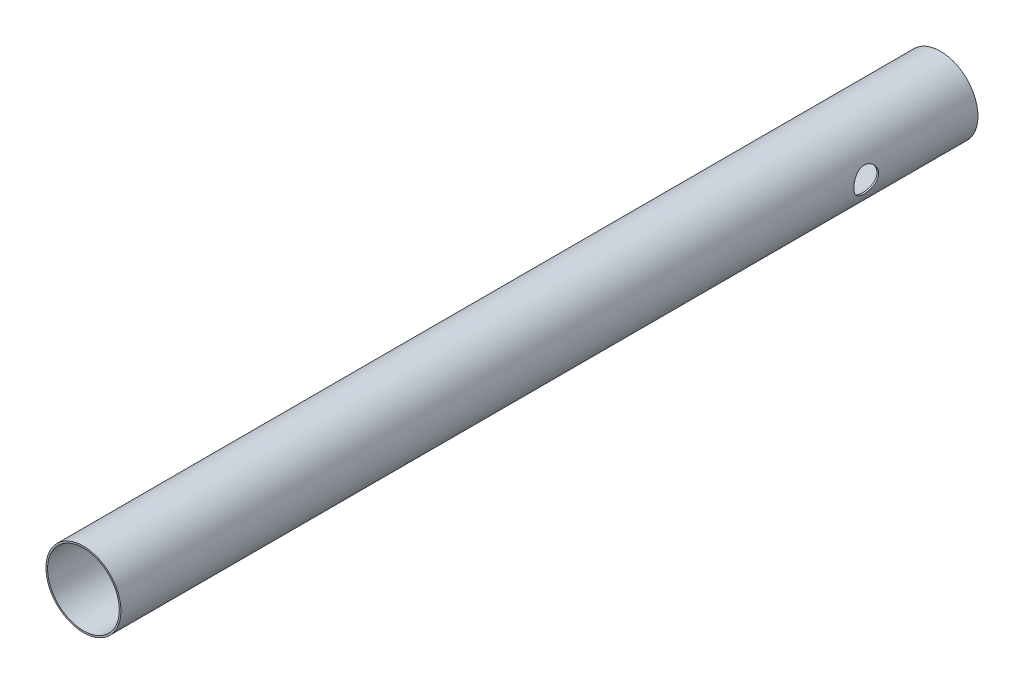
ISO-10303-21;
HEADER;
FILE_DESCRIPTION(('STEP AP214'),'2;1');
FILE_NAME('part.step','',(''),(''),'','','');
FILE_SCHEMA(('AUTOMOTIVE_DESIGN { 1 0 10303 214 1 1 1 1 }'));
ENDSEC;
DATA;
#1=APPLICATION_CONTEXT('core data for automotive mechanical design processes');
#2=APPLICATION_PROTOCOL_DEFINITION('international standard','automotive_design',2000,#1);
#3=PRODUCT_CONTEXT('',#1,'mechanical');
#4=PRODUCT('Part','Part','',(#3));
#5=PRODUCT_RELATED_PRODUCT_CATEGORY('part','',(#4));
#6=PRODUCT_DEFINITION_FORMATION('','',#4);
#7=PRODUCT_DEFINITION_CONTEXT('part definition',#1,'design');
#8=PRODUCT_DEFINITION('design','',#6,#7);
#9=PRODUCT_DEFINITION_SHAPE('','',#8);
#10=(LENGTH_UNIT() NAMED_UNIT(*) SI_UNIT(.MILLI.,.METRE.));
#11=(NAMED_UNIT(*) PLANE_ANGLE_UNIT() SI_UNIT($,.RADIAN.));
#12=(NAMED_UNIT(*) SI_UNIT($,.STERADIAN.) SOLID_ANGLE_UNIT());
#13=UNCERTAINTY_MEASURE_WITH_UNIT(LENGTH_MEASURE(1.E-05),#10,'distance_accuracy_value','');
#14=(GEOMETRIC_REPRESENTATION_CONTEXT(3) GLOBAL_UNCERTAINTY_ASSIGNED_CONTEXT((#13)) GLOBAL_UNIT_ASSIGNED_CONTEXT((#10,
#11,#12)) REPRESENTATION_CONTEXT('',''));
#15=CARTESIAN_POINT('',(0.,0.,0.));
#16=DIRECTION('',(0.,0.,1.));
#17=DIRECTION('',(1.,0.,0.));
#18=AXIS2_PLACEMENT_3D('',#15,#16,#17);
#19=CARTESIAN_POINT('',(0.,0.,-114.3));
#20=DIRECTION('',(0.,0.,1.));
#21=DIRECTION('',(1.,0.,0.));
#22=AXIS2_PLACEMENT_3D('',#19,#20,#21);
#23=CYLINDRICAL_SURFACE('',#22,38.354);
#24=CARTESIAN_POINT('',(0.,0.,-114.3));
#25=DIRECTION('',(0.,0.,1.));
#26=DIRECTION('',(1.,0.,0.));
#27=AXIS2_PLACEMENT_3D('',#24,#25,#26);
#28=CIRCLE('',#27,38.354);
#29=CARTESIAN_POINT('',(38.354,0.,-114.3));
#30=VERTEX_POINT('',#29);
#31=EDGE_CURVE('E10',#30,#30,#28,.T.);
#32=ORIENTED_EDGE('',*,*,#31,.T.);
#33=EDGE_LOOP('',(#32));
#34=FACE_BOUND('',#33,.T.);
#35=CARTESIAN_POINT('',(0.,0.,762.));
#36=DIRECTION('',(0.,0.,1.));
#37=DIRECTION('',(1.,0.,0.));
#38=AXIS2_PLACEMENT_3D('',#35,#36,#37);
#39=CIRCLE('',#38,38.354);
#40=CARTESIAN_POINT('',(38.354,0.,762.));
#41=VERTEX_POINT('',#40);
#42=EDGE_CURVE('E64',#41,#41,#39,.T.);
#43=ORIENTED_EDGE('',*,*,#42,.F.);
#44=EDGE_LOOP('',(#43));
#45=FACE_BOUND('',#44,.T.);
#46=CARTESIAN_POINT('',(38.354,0.,12.7));
#47=CARTESIAN_POINT('',(38.3540000493044,0.346608619146713,12.7000000775963));
#48=CARTESIAN_POINT('',(38.3492907128234,0.693216154606999,12.6857991326662));
#49=CARTESIAN_POINT('',(38.3305830123983,1.38385618020903,12.6291326372584));
#50=CARTESIAN_POINT('',(38.3165846889567,1.72788868157198,12.5866672100213));
#51=CARTESIAN_POINT('',(38.2796798010668,2.41089498344884,12.4738688931755));
#52=CARTESIAN_POINT('',(38.2567724372097,2.74986832716919,12.4035335027826));
#53=CARTESIAN_POINT('',(38.2026679211,3.42032162893621,12.2356376664278));
#54=CARTESIAN_POINT('',(38.1714707206801,3.75180154343092,12.1380770622764));
#55=CARTESIAN_POINT('',(38.1016751459268,4.40445273633742,11.9167668667314));
#56=CARTESIAN_POINT('',(38.0630894444205,4.72564058227501,11.7930620809388));
#57=CARTESIAN_POINT('',(37.9794867125445,5.35621814577783,11.5203701972046));
#58=CARTESIAN_POINT('',(37.9344696989119,5.66560789404444,11.3713831650587));
#59=CARTESIAN_POINT('',(37.8391560266141,6.27067747666276,11.0492566909436));
#60=CARTESIAN_POINT('',(37.7888594993686,6.56635765201449,10.8761178501353));
#61=CARTESIAN_POINT('',(37.684234604624,7.14237425122249,10.50683493065));
#62=CARTESIAN_POINT('',(37.629904793183,7.42270511690967,10.3106825982647));
#63=CARTESIAN_POINT('',(37.516876005993,7.97465414849725,9.8903430535432));
#64=CARTESIAN_POINT('',(37.4580941185265,8.24574103459471,9.66548029444939));
#65=CARTESIAN_POINT('',(37.3392598973929,8.76816787035007,9.19418311120439));
#66=CARTESIAN_POINT('',(37.2792075359525,9.01950738775308,8.947748215105));
#67=CARTESIAN_POINT('',(37.159410967394,9.50100392623369,8.43473321550048));
#68=CARTESIAN_POINT('',(37.0996668861884,9.73115285306928,8.16814548437142));
#69=CARTESIAN_POINT('',(36.982150882995,10.1686345833711,7.61660855228789));
#70=CARTESIAN_POINT('',(36.9243782913845,10.3759751880481,7.33166568261063));
#71=CARTESIAN_POINT('',(36.8107888158904,10.7721318253782,6.73665583938064));
#72=CARTESIAN_POINT('',(36.7550748964656,10.9602497556524,6.4261037655917));
#73=CARTESIAN_POINT('',(36.6491024955132,11.3095505445197,5.78929612922831));
#74=CARTESIAN_POINT('',(36.5988441434059,11.4707327641771,5.46304019438262));
#75=CARTESIAN_POINT('',(36.5053831962393,11.7647833494334,4.79711530856339));
#76=CARTESIAN_POINT('',(36.4621789465311,11.8976583571626,4.45744952635741));
#77=CARTESIAN_POINT('',(36.3842349156935,12.1339302590436,3.76707165015623));
#78=CARTESIAN_POINT('',(36.3494947592375,12.2373284603318,3.4163600467494));
#79=CARTESIAN_POINT('',(36.2906599816199,12.4106976781298,2.71837349134683));
#80=CARTESIAN_POINT('',(36.2662493073493,12.4816674168499,2.37137319027426));
#81=CARTESIAN_POINT('',(36.2272473003618,12.5944210658967,1.67211372153357));
#82=CARTESIAN_POINT('',(36.212655766156,12.6362055751055,1.3198546619269));
#83=CARTESIAN_POINT('',(36.1937857654808,12.6901539880783,0.612892420342079));
#84=CARTESIAN_POINT('',(36.1895045860218,12.7023256839452,0.258189905957597));
#85=CARTESIAN_POINT('',(36.1913936047527,12.6969428313659,-0.450956312808769));
#86=CARTESIAN_POINT('',(36.1975635131064,12.679389107284,-0.805400024095227));
#87=CARTESIAN_POINT('',(36.2196328238879,12.6162022726288,-1.49531954387969));
#88=CARTESIAN_POINT('',(36.2350810038449,12.5718708795356,-1.83093002369664));
#89=CARTESIAN_POINT('',(36.2748385070344,12.4566895371294,-2.49702139350318));
#90=CARTESIAN_POINT('',(36.2991475244303,12.3858405030842,-2.82750246012671));
#91=CARTESIAN_POINT('',(36.3559017440017,12.2182461452673,-3.48113607780465));
#92=CARTESIAN_POINT('',(36.3883476100467,12.1214987084518,-3.80428802854377));
#93=CARTESIAN_POINT('',(36.4604324256871,11.9029161919708,-4.4411645783651));
#94=CARTESIAN_POINT('',(36.5000715640481,11.7810804539273,-4.75488892979656));
#95=CARTESIAN_POINT('',(36.5861027259181,11.5111585146129,-5.37583818164387));
#96=CARTESIAN_POINT('',(36.6325911470783,11.362689609778,-5.68288327111756));
#97=CARTESIAN_POINT('',(36.7305642323169,11.0418790488918,-6.28354072437708));
#98=CARTESIAN_POINT('',(36.7820507355843,10.8695285948864,-6.57714808443472));
#99=CARTESIAN_POINT('',(36.8886130638769,10.5021947657251,-7.14908375831122));
#100=CARTESIAN_POINT('',(36.9436883096209,10.3072150393512,-7.42741452472328));
#101=CARTESIAN_POINT('',(37.0560280412202,9.89573632914247,-7.96741434842017));
#102=CARTESIAN_POINT('',(37.1132935273178,9.67922743935104,-8.22907564408642));
#103=CARTESIAN_POINT('',(37.2315102727711,9.21435758989426,-8.74716509346786));
#104=CARTESIAN_POINT('',(37.2924993989009,8.96493019051237,-9.00262875823346));
#105=CARTESIAN_POINT('',(37.4135625447484,8.44545673499238,-9.49165217190122));
#106=CARTESIAN_POINT('',(37.4736369359882,8.17541933293374,-9.72522102356878));
#107=CARTESIAN_POINT('',(37.5912926375788,7.61614842114486,-10.1691597885803));
#108=CARTESIAN_POINT('',(37.6488726162076,7.32690486130588,-10.3795174003582));
#109=CARTESIAN_POINT('',(37.7599129827998,6.73127135439834,-10.7753326702776));
#110=CARTESIAN_POINT('',(37.8133750220724,6.42488836628661,-10.9608003317637));
#111=CARTESIAN_POINT('',(37.9152406672159,5.79370563459675,-11.3072479245701));
#112=CARTESIAN_POINT('',(37.9635887262647,5.46875313293128,-11.4679661977654));
#113=CARTESIAN_POINT('',(38.053236636367,4.80546342051625,-11.7613358626229));
#114=CARTESIAN_POINT('',(38.094536398965,4.46712604185322,-11.8939869020486));
#115=CARTESIAN_POINT('',(38.168880829881,3.77959795977295,-12.1299916041445));
#116=CARTESIAN_POINT('',(38.2019277914561,3.43041030178402,-12.2333534066751));
#117=CARTESIAN_POINT('',(38.2588052232789,2.72374039936429,-12.4098287975175));
#118=CARTESIAN_POINT('',(38.282636111525,2.3662585319003,-12.4829437576971));
#119=CARTESIAN_POINT('',(38.3195605698831,1.66126737185945,-12.5957180611134));
#120=CARTESIAN_POINT('',(38.3330705475255,1.31398730104149,-12.636676948026));
#121=CARTESIAN_POINT('',(38.3506210975933,0.616996820413901,-12.6898170912854));
#122=CARTESIAN_POINT('',(38.3546619408564,0.26728648040219,-12.7019991707112));
#123=CARTESIAN_POINT('',(38.3531614902705,-0.431872203161492,-12.697467586317));
#124=CARTESIAN_POINT('',(38.3476216196799,-0.781320577914644,-12.6807582144535));
#125=CARTESIAN_POINT('',(38.3271172194591,-1.47737106769066,-12.6186155337272));
#126=CARTESIAN_POINT('',(38.3121527828627,-1.82397321077569,-12.573182508408));
#127=CARTESIAN_POINT('',(38.2737726195383,-2.50192434649081,-12.4557349490977));
#128=CARTESIAN_POINT('',(38.25061058186,-2.83342619910268,-12.3845169992677));
#129=CARTESIAN_POINT('',(38.1963867087895,-3.48906296604509,-12.2160141079389));
#130=CARTESIAN_POINT('',(38.1653250650877,-3.81319805892828,-12.1187297989589));
#131=CARTESIAN_POINT('',(38.0960958534465,-4.4519664004682,-11.8989107276176));
#132=CARTESIAN_POINT('',(38.0579289206559,-4.76660049550904,-11.7763782221129));
#133=CARTESIAN_POINT('',(37.975427197786,-5.38455812766887,-11.5069630035043));
#134=CARTESIAN_POINT('',(37.9310900763891,-5.68787733443099,-11.3600710825047));
#135=CARTESIAN_POINT('',(37.8361351632391,-6.28897134119984,-11.0389282616613));
#136=CARTESIAN_POINT('',(37.7853844882026,-6.58639930777716,-10.8640675204075));
#137=CARTESIAN_POINT('',(37.6798440322587,-7.1655659467404,-10.4911063641556));
#138=CARTESIAN_POINT('',(37.6250540107183,-7.44730368266615,-10.2930045642191));
#139=CARTESIAN_POINT('',(37.5128100950073,-7.99350723051985,-9.87482522363922));
#140=CARTESIAN_POINT('',(37.4553555728245,-8.25796893481308,-9.65474248792946));
#141=CARTESIAN_POINT('',(37.3392459413656,-8.76803612612187,-9.19400154623394));
#142=CARTESIAN_POINT('',(37.2805908020647,-9.01364114083792,-8.95334282520473));
#143=CARTESIAN_POINT('',(37.1609444154283,-9.49514644068471,-8.4416282690028));
#144=CARTESIAN_POINT('',(37.0999664766562,-9.73011637811871,-8.16969292238694));
#145=CARTESIAN_POINT('',(36.9800531379832,-10.17636392117,-7.60661976765515));
#146=CARTESIAN_POINT('',(36.9211176943478,-10.387642034301,-7.31548237108761));
#147=CARTESIAN_POINT('',(36.8069797105673,-10.7850979180163,-6.71573578405083));
#148=CARTESIAN_POINT('',(36.7517781455589,-10.9712691442242,-6.40712206784455));
#149=CARTESIAN_POINT('',(36.6468017481375,-11.3169729038126,-5.77459646590806));
#150=CARTESIAN_POINT('',(36.5970246593168,-11.4765165282121,-5.45069102202347));
#151=CARTESIAN_POINT('',(36.5045135615471,-11.7674584709672,-4.79028680201327));
#152=CARTESIAN_POINT('',(36.4617655847977,-11.8989127663106,-4.45381467210279));
#153=CARTESIAN_POINT('',(36.384571084121,-12.1329098429519,-3.77002275800971));
#154=CARTESIAN_POINT('',(36.3501245863519,-12.2354525331487,-3.42270293964959));
#155=CARTESIAN_POINT('',(36.2906987025744,-12.4106030518081,-2.71993038198198));
#156=CARTESIAN_POINT('',(36.2657158084055,-12.4832219738988,-2.36448070832988));
#157=CARTESIAN_POINT('',(36.2260642143644,-12.5978285053863,-1.64811282419851));
#158=CARTESIAN_POINT('',(36.2113950039516,-12.6398176310018,-1.28719488530908));
#159=CARTESIAN_POINT('',(36.1933553351449,-12.691376498764,-0.581211409186931));
#160=CARTESIAN_POINT('',(36.1894492360935,-12.7024834090303,-0.236270951439338));
#161=CARTESIAN_POINT('',(36.191517735823,-12.6965890979914,0.453332656351166));
#162=CARTESIAN_POINT('',(36.1974919841301,-12.679588873697,0.797995815796469));
#163=CARTESIAN_POINT('',(36.2191283990484,-12.6176512184469,1.48446858044539));
#164=CARTESIAN_POINT('',(36.2347899742106,-12.5727154930616,1.82627835856791));
#165=CARTESIAN_POINT('',(36.2753034021292,-12.4553412146282,2.50458500070517));
#166=CARTESIAN_POINT('',(36.3001552855088,-12.3829025699371,2.84108184701272));
#167=CARTESIAN_POINT('',(36.3577375573539,-12.2127855712595,3.50022441647368));
#168=CARTESIAN_POINT('',(36.3903131876907,-12.1156005314389,3.82301129790117));
#169=CARTESIAN_POINT('',(36.4626273956097,-11.8961947444055,4.45911932355504));
#170=CARTESIAN_POINT('',(36.5023658434433,-11.7739744506802,4.77244063912233));
#171=CARTESIAN_POINT('',(36.5878934378161,-11.5054426916363,5.387713765061));
#172=CARTESIAN_POINT('',(36.6336825346891,-11.3591314240636,5.68966566873095));
#173=CARTESIAN_POINT('',(36.7300946374629,-11.0434010898271,6.28056979206684));
#174=CARTESIAN_POINT('',(36.7807195061561,-10.8739731074982,6.56951693859033));
#175=CARTESIAN_POINT('',(36.8877125052781,-10.5054434526529,7.14473665622644));
#176=CARTESIAN_POINT('',(36.9442336488221,-10.3053827757613,7.4303666501638));
#177=CARTESIAN_POINT('',(37.0595618677583,-9.88262141338054,7.98405798687949));
#178=CARTESIAN_POINT('',(37.1183699746189,-9.65991043724281,8.25211125228769));
#179=CARTESIAN_POINT('',(37.2366950037109,-9.19324781450849,8.76900574810763));
#180=CARTESIAN_POINT('',(37.2962121071586,-8.94929063237118,9.01784193959982));
#181=CARTESIAN_POINT('',(37.4143540068057,-8.44175806952568,9.49462480763226));
#182=CARTESIAN_POINT('',(37.4729791743893,-8.17819113903035,9.72258038861963));
#183=CARTESIAN_POINT('',(37.5900715482598,-7.62230869932747,10.1647116983876));
#184=CARTESIAN_POINT('',(37.6484444691894,-7.32927470624122,10.3780102654757));
#185=CARTESIAN_POINT('',(37.7609575560227,-6.72559456489198,10.7790370188645));
#186=CARTESIAN_POINT('',(37.8150993318708,-6.41495519383412,10.9667749513287));
#187=CARTESIAN_POINT('',(37.9176476949261,-5.77800555910342,11.3153189378685));
#188=CARTESIAN_POINT('',(37.9660543203654,-5.45169539991676,11.4761251714813));
#189=CARTESIAN_POINT('',(38.055744181617,-4.78565858088001,11.7694460943283));
#190=CARTESIAN_POINT('',(38.0970278090913,-4.44593265996627,11.9019623391987));
#191=CARTESIAN_POINT('',(38.1694498373699,-3.77245769359671,12.1317302397377));
#192=CARTESIAN_POINT('',(38.2009864021627,-3.43923222435402,12.2303923092374));
#193=CARTESIAN_POINT('',(38.2556856611279,-2.76516629671906,12.4001870382465));
#194=CARTESIAN_POINT('',(38.2788486621328,-2.42432611783868,12.4713207064859));
#195=CARTESIAN_POINT('',(38.3161647377881,-1.73754681534794,12.585391242567));
#196=CARTESIAN_POINT('',(38.3303198254786,-1.39160884865675,12.6283344103382));
#197=CARTESIAN_POINT('',(38.3492374417668,-0.697113559717879,12.6856387803868));
#198=CARTESIAN_POINT('',(38.3539999504186,-0.348556231909324,12.6999999219677));
#199=CARTESIAN_POINT('',(38.354,0.,12.7));
#200=B_SPLINE_CURVE_WITH_KNOTS('',3,(#46,#47,#48,#49,#50,#51,#52,#53,#54,#55,#56,#57,#58,#59,
#60,#61,#62,#63,#64,#65,#66,#67,#68,#69,#70,#71,#72,#73,#74,#75,#76,#77,#78,#79,#80,#81,#82,#83,
#84,#85,#86,#87,#88,#89,#90,#91,#92,#93,#94,#95,#96,#97,#98,#99,#100,#101,#102,#103,#104,#105,
#106,#107,#108,#109,#110,#111,#112,#113,#114,#115,#116,#117,#118,#119,#120,#121,#122,#123,#124,
#125,#126,#127,#128,#129,#130,#131,#132,#133,#134,#135,#136,#137,#138,#139,#140,#141,#142,#143,
#144,#145,#146,#147,#148,#149,#150,#151,#152,#153,#154,#155,#156,#157,#158,#159,#160,#161,#162,
#163,#164,#165,#166,#167,#168,#169,#170,#171,#172,#173,#174,#175,#176,#177,#178,#179,#180,#181,
#182,#183,#184,#185,#186,#187,#188,#189,#190,#191,#192,#193,#194,#195,#196,#197,#198,#199),
.UNSPECIFIED.,.T.,.F.,(4,2,2,2,2,2,2,2,2,2,2,2,2,2,2,2,2,2,2,2,2,2,2,2,2,2,2,2,2,2,2,2,2,2,2,2,
2,2,2,2,2,2,2,2,2,2,2,2,2,2,2,2,2,2,2,2,2,2,2,2,2,2,2,2,2,2,2,2,2,2,2,2,2,2,2,2,4),(0.,
1.03950270000649,2.07900086753871,3.11859233083347,4.15818983470167,5.19601992980908,
6.23384732405939,7.27164889042899,8.30982380508138,9.37985430356095,10.4499082176734,
11.5203691828249,12.5904628684993,13.6911155524307,14.7917943409834,15.8922145762018,
16.9925860061596,18.0563045285723,19.1200012227948,20.1834179932295,21.2468052727921,
22.2622469536092,23.2776535892488,24.2931430969103,25.3086592568812,26.3401463127081,
27.3720143833213,28.4037163043274,29.4358951460832,30.5212629714878,31.6061775352601,
32.6916643513945,33.7767135922377,34.8725453423925,35.9683908441346,37.0639314967779,
38.1594224549197,39.2079628212558,40.2564731967047,41.3048278245509,42.353172103796,
43.3715628162292,44.3899288189244,45.4082038325537,46.4268646367255,47.4718974315906,
48.5169925317915,49.5623352212874,50.6077040847233,51.699992338373,52.792257189131,
53.8848062022677,54.9768990012846,56.0667947284711,57.1566938899096,58.2461886290993,
59.3356294330868,60.3697799545339,61.4038937935787,62.4379445021767,63.4719986563813,
64.4868640251517,65.5017110123182,66.5165496697294,67.531780842836,68.5904194557283,
69.6495412040144,70.7089397288757,71.7678843537645,72.8678934802255,73.9674819960867,
75.0670631813748,76.1665838862877,77.2121974488547,78.257772693114,79.3031141956974,
80.3484579181524),.UNSPECIFIED.);
#201=CARTESIAN_POINT('',(38.354,0.,12.7));
#202=VERTEX_POINT('',#201);
#203=EDGE_CURVE('E74',#202,#202,#200,.T.);
#204=ORIENTED_EDGE('',*,*,#203,.T.);
#205=EDGE_LOOP('',(#204));
#206=FACE_BOUND('',#205,.T.);
#207=ADVANCED_FACE('F45',(#34,#45,#206),#23,.T.);
#208=CARTESIAN_POINT('',(0.,0.,-114.3));
#209=DIRECTION('',(0.,0.,1.));
#210=DIRECTION('',(1.,0.,0.));
#211=AXIS2_PLACEMENT_3D('',#208,#209,#210);
#212=CYLINDRICAL_SURFACE('',#211,36.6776);
#213=CARTESIAN_POINT('',(0.,0.,-114.3));
#214=DIRECTION('',(0.,0.,1.));
#215=DIRECTION('',(1.,0.,0.));
#216=AXIS2_PLACEMENT_3D('',#213,#214,#215);
#217=CIRCLE('',#216,36.6776);
#218=CARTESIAN_POINT('',(36.6776,0.,-114.3));
#219=VERTEX_POINT('',#218);
#220=EDGE_CURVE('E59',#219,#219,#217,.T.);
#221=ORIENTED_EDGE('',*,*,#220,.F.);
#222=EDGE_LOOP('',(#221));
#223=FACE_BOUND('',#222,.T.);
#224=CARTESIAN_POINT('',(0.,0.,762.));
#225=DIRECTION('',(0.,0.,1.));
#226=DIRECTION('',(1.,0.,0.));
#227=AXIS2_PLACEMENT_3D('',#224,#225,#226);
#228=CIRCLE('',#227,36.6776);
#229=CARTESIAN_POINT('',(36.6776,0.,762.));
#230=VERTEX_POINT('',#229);
#231=EDGE_CURVE('E70',#230,#230,#228,.T.);
#232=ORIENTED_EDGE('',*,*,#231,.T.);
#233=EDGE_LOOP('',(#232));
#234=FACE_BOUND('',#233,.T.);
#235=CARTESIAN_POINT('',(36.6776,0.,-12.7));
#236=CARTESIAN_POINT('',(36.6776003715728,-0.345699129298863,-12.7000005347251));
#237=CARTESIAN_POINT('',(36.6727015065215,-0.691390287795305,-12.6858737416097));
#238=CARTESIAN_POINT('',(36.6532415560961,-1.38018906579821,-12.6295081236149));
#239=CARTESIAN_POINT('',(36.6386807681325,-1.72329676449923,-12.5872701640453));
#240=CARTESIAN_POINT('',(36.6002932013032,-2.40442161047754,-12.4750908783771));
#241=CARTESIAN_POINT('',(36.5764663569298,-2.74243872174873,-12.4051493564247));
#242=CARTESIAN_POINT('',(36.5201868942223,-3.41098719568521,-12.2382138369139));
#243=CARTESIAN_POINT('',(36.4877341666242,-3.7415184634699,-12.1412194966774));
#244=CARTESIAN_POINT('',(36.415125823154,-4.39226126348948,-11.9212331570574));
#245=CARTESIAN_POINT('',(36.3749841578739,-4.71249027726159,-11.7982882011664));
#246=CARTESIAN_POINT('',(36.2879969311875,-5.34119294287567,-11.5273083337372));
#247=CARTESIAN_POINT('',(36.2411513986022,-5.64966664524849,-11.379273530064));
#248=CARTESIAN_POINT('',(36.141943123645,-6.25297988711888,-11.0592425868718));
#249=CARTESIAN_POINT('',(36.089580458221,-6.54781961668788,-10.8872467815278));
#250=CARTESIAN_POINT('',(35.9806216882147,-7.12226925055713,-10.5204310557531));
#251=CARTESIAN_POINT('',(35.9240239484347,-7.40187319943256,-10.3256023027195));
#252=CARTESIAN_POINT('',(35.8060950139267,-7.95310920237156,-9.90765351772054));
#253=CARTESIAN_POINT('',(35.7446692850392,-8.22417461754259,-9.68381258114161));
#254=CARTESIAN_POINT('',(35.6203942715804,-8.74677322372839,-9.21451881081014));
#255=CARTESIAN_POINT('',(35.557544348741,-8.99829742420968,-8.96905613884122));
#256=CARTESIAN_POINT('',(35.432096138447,-9.48023905875307,-8.45804027608361));
#257=CARTESIAN_POINT('',(35.3694979150267,-9.71065141107979,-8.19248227618138));
#258=CARTESIAN_POINT('',(35.2462836158299,-10.1487737020916,-7.64302321611955));
#259=CARTESIAN_POINT('',(35.1856666738277,-10.3564936576229,-7.35913033809349));
#260=CARTESIAN_POINT('',(35.0661800474578,-10.7542487042229,-6.76519913077627));
#261=CARTESIAN_POINT('',(35.0074283341713,-10.9435052454828,-6.45461487165701));
#262=CARTESIAN_POINT('',(34.895610590468,-11.2949865231617,-5.81769069334391));
#263=CARTESIAN_POINT('',(34.8425422722961,-11.457222151106,-5.49135719106147));
#264=CARTESIAN_POINT('',(34.7437567195772,-11.7533866227265,-4.82502009697151));
#265=CARTESIAN_POINT('',(34.6980391537207,-11.8873167422609,-4.48501712213194));
#266=CARTESIAN_POINT('',(34.6154773852799,-12.125633764557,-3.79376346192396));
#267=CARTESIAN_POINT('',(34.5786327478283,-12.2300221152217,-3.44251332874157));
#268=CARTESIAN_POINT('',(34.5162362202012,-12.405002961918,-2.74422351598196));
#269=CARTESIAN_POINT('',(34.4903259600842,-12.476675549067,-2.39748646069534));
#270=CARTESIAN_POINT('',(34.4488033332518,-12.5908695904941,-1.69863129599444));
#271=CARTESIAN_POINT('',(34.4331907373369,-12.6333916935882,-1.34651330652448));
#272=CARTESIAN_POINT('',(34.4128010465614,-12.6888274494694,-0.639743897499098));
#273=CARTESIAN_POINT('',(34.4080207845879,-12.7017497565346,-0.285093248861232));
#274=CARTESIAN_POINT('',(34.4094527737971,-12.6978703213213,0.424017333158606));
#275=CARTESIAN_POINT('',(34.4156646820117,-12.6810695064382,0.778477272145763));
#276=CARTESIAN_POINT('',(34.4382834216181,-12.6195076221635,1.46676385496111));
#277=CARTESIAN_POINT('',(34.4541660690596,-12.5761835750871,1.80073750564172));
#278=CARTESIAN_POINT('',(34.495164423506,-12.4632890965151,2.4636274328292));
#279=CARTESIAN_POINT('',(34.5202797776835,-12.3937196679824,2.79254390209558));
#280=CARTESIAN_POINT('',(34.5789904421954,-12.2289573212845,3.44314193704388));
#281=CARTESIAN_POINT('',(34.6125865089045,-12.1337621175668,3.76482285461556));
#282=CARTESIAN_POINT('',(34.6872788355812,-11.9185564874774,4.39887543243171));
#283=CARTESIAN_POINT('',(34.7283753085553,-11.7985453563371,4.71124682799882));
#284=CARTESIAN_POINT('',(34.8176590843248,-11.5324313126041,5.32994628717814));
#285=CARTESIAN_POINT('',(34.8659538315211,-11.3859242486294,5.63608489790037));
#286=CARTESIAN_POINT('',(34.9677795713578,-11.069254353597,6.23509676035465));
#287=CARTESIAN_POINT('',(35.0213124882097,-10.8990828197917,6.52796507908421));
#288=CARTESIAN_POINT('',(35.1321713362594,-10.5362635586557,7.09869722821694));
#289=CARTESIAN_POINT('',(35.1894975294752,-10.3436142779883,7.37656001971186));
#290=CARTESIAN_POINT('',(35.3064608464446,-9.93704694664468,7.91575112976541));
#291=CARTESIAN_POINT('',(35.3660980586745,-9.72312808118135,8.17707881427543));
#292=CARTESIAN_POINT('',(35.4896067584501,-9.262514757363,8.69614653444317));
#293=CARTESIAN_POINT('',(35.5535260696589,-9.01464787251324,8.95283603503115));
#294=CARTESIAN_POINT('',(35.6804937735652,-8.49819838496543,9.444452242855));
#295=CARTESIAN_POINT('',(35.7435425153377,-8.22962438751424,9.67938790194043));
#296=CARTESIAN_POINT('',(35.8671219529557,-7.67314585729641,10.1262148046937));
#297=CARTESIAN_POINT('',(35.9276512559817,-7.38523085622746,10.3380934035434));
#298=CARTESIAN_POINT('',(36.0444893084209,-6.79208728389428,10.7370969959956));
#299=CARTESIAN_POINT('',(36.1007997549494,-6.48686576225871,10.9242319666161));
#300=CARTESIAN_POINT('',(36.2083142599703,-5.85725878095522,11.2744753524838));
#301=CARTESIAN_POINT('',(36.2594507845699,-5.53269073381587,11.4372766827911));
#302=CARTESIAN_POINT('',(36.3544022912388,-4.86989108632737,11.7348248937835));
#303=CARTESIAN_POINT('',(36.3982171681536,-4.53165928982452,11.8695713715486));
#304=CARTESIAN_POINT('',(36.4772419976013,-3.84406865548134,12.1097359874351));
#305=CARTESIAN_POINT('',(36.5124545723585,-3.49471324522848,12.2151630642963));
#306=CARTESIAN_POINT('',(36.5732482383419,-2.78743700047141,12.3957001528334));
#307=CARTESIAN_POINT('',(36.5988298118881,-2.42951659585669,12.4708116827238));
#308=CARTESIAN_POINT('',(36.6386481638633,-1.72469398090349,12.5871774793695));
#309=CARTESIAN_POINT('',(36.6533559548249,-1.37805034847953,12.629840082331));
#310=CARTESIAN_POINT('',(36.6729076188059,-0.682152887021205,12.6864701272777));
#311=CARTESIAN_POINT('',(36.6777517970225,-0.332899139083955,12.7004384571136));
#312=CARTESIAN_POINT('',(36.6774409553077,0.365507570417302,12.6995406116192));
#313=CARTESIAN_POINT('',(36.6722875697656,0.714660539124013,12.6846791493477));
#314=CARTESIAN_POINT('',(36.6521288367049,1.4102690339787,12.6262804197687));
#315=CARTESIAN_POINT('',(36.6371236026138,1.75672459113634,12.582743482611));
#316=CARTESIAN_POINT('',(36.598306693395,2.43341078905293,12.4692601788489));
#317=CARTESIAN_POINT('',(36.5747900958183,2.7638071163884,12.4001972363953));
#318=CARTESIAN_POINT('',(36.519519163734,3.41739995900889,12.2362123861762));
#319=CARTESIAN_POINT('',(36.4877650507505,3.740596667653,12.1412911737905));
#320=CARTESIAN_POINT('',(36.4168240206807,4.37767035296022,11.9263996291764));
#321=CARTESIAN_POINT('',(36.3776377669421,4.69154815848256,11.8064315323845));
#322=CARTESIAN_POINT('',(36.2927861186747,5.30819480578222,11.5423401841366));
#323=CARTESIAN_POINT('',(36.2471182714462,5.61095938736604,11.3982077849075));
#324=CARTESIAN_POINT('',(36.1491182573575,6.21149253568666,11.0826665805481));
#325=CARTESIAN_POINT('',(36.0966393971357,6.50890524751176,10.9106261593456));
#326=CARTESIAN_POINT('',(35.9873376908715,7.08835970691807,10.5433801280268));
#327=CARTESIAN_POINT('',(35.9305133509246,7.37039611078048,10.3481665385017));
#328=CARTESIAN_POINT('',(35.8139504241565,7.91741879793583,9.93588422363167));
#329=CARTESIAN_POINT('',(35.7542115172467,8.18240320106913,9.71881309501139));
#330=CARTESIAN_POINT('',(35.6333136952758,8.69381115742851,9.26416319762187));
#331=CARTESIAN_POINT('',(35.5721547298167,8.94023405058291,9.02658370019221));
#332=CARTESIAN_POINT('',(35.4469281830243,9.42482450460951,8.52006582527128));
#333=CARTESIAN_POINT('',(35.382866340055,9.66198108157917,8.25015766172468));
#334=CARTESIAN_POINT('',(35.2566918649402,10.1127043430848,7.69104105002202));
#335=CARTESIAN_POINT('',(35.1945785988886,10.3262787574955,7.40183897627846));
#336=CARTESIAN_POINT('',(35.0740444036124,10.7285541413388,6.80569464575975));
#337=CARTESIAN_POINT('',(35.0156251103575,10.9172441296812,6.49874464248467));
#338=CARTESIAN_POINT('',(34.9042819393645,11.2681556909433,5.86928005132756));
#339=CARTESIAN_POINT('',(34.8513557659552,11.4303883371769,5.54677204862174));
#340=CARTESIAN_POINT('',(34.7526332383591,11.7271176105694,4.88826117077108));
#341=CARTESIAN_POINT('',(34.7068353189276,11.8616203288658,4.552261278661));
#342=CARTESIAN_POINT('',(34.6238480745853,12.101720574126,3.86903866653458));
#343=CARTESIAN_POINT('',(34.5866587910844,12.2073179620475,3.52181589254218));
#344=CARTESIAN_POINT('',(34.5221667609533,12.3885271717526,2.81887824775676));
#345=CARTESIAN_POINT('',(34.494859889854,12.4641515041823,2.46316698589777));
#346=CARTESIAN_POINT('',(34.4510740459093,12.5846720366744,1.74592308456438));
#347=CARTESIAN_POINT('',(34.4345944678271,12.6295699543238,1.38439077163957));
#348=CARTESIAN_POINT('',(34.4136502156331,12.6865232673969,0.678575125641134));
#349=CARTESIAN_POINT('',(34.4085710378357,12.7002588530445,0.334444583991077));
#350=CARTESIAN_POINT('',(34.4087650126452,12.6997337840062,-0.353784661767209));
#351=CARTESIAN_POINT('',(34.4140377652694,12.6854742110103,-0.697883366591825));
#352=CARTESIAN_POINT('',(34.4347627040718,12.6291073769587,-1.38345250868118));
#353=CARTESIAN_POINT('',(34.4502141760226,12.5870020698009,-1.72492312865451));
#354=CARTESIAN_POINT('',(34.490797951158,12.4753644172257,-2.40276218759652));
#355=CARTESIAN_POINT('',(34.5159302763828,12.4058320093654,-2.73913061494731));
#356=CARTESIAN_POINT('',(34.5744263309021,12.2418452768053,-3.39699698084265));
#357=CARTESIAN_POINT('',(34.6075948022449,12.147978890238,-3.71865926742804));
#358=CARTESIAN_POINT('',(34.6814628547362,11.9354564139409,-4.35278074965404));
#359=CARTESIAN_POINT('',(34.7221622768168,11.8168008477984,-4.66524013951558));
#360=CARTESIAN_POINT('',(34.8099518669435,11.5556288503268,-5.27908135616035));
#361=CARTESIAN_POINT('',(34.8570420426748,11.4131123903032,-5.58046316962139));
#362=CARTESIAN_POINT('',(34.9563637760925,11.1051853922804,-6.17054806337403));
#363=CARTESIAN_POINT('',(35.0085973192415,10.939766003119,-6.45924618477489));
#364=CARTESIAN_POINT('',(35.119331474337,10.5790406810865,-7.03524128846456));
#365=CARTESIAN_POINT('',(35.1780098683121,10.3827097633105,-7.32186249201316));
#366=CARTESIAN_POINT('',(35.2979210855436,9.96743822701268,-7.87785713711651));
#367=CARTESIAN_POINT('',(35.3591550606623,9.74848734607492,-8.1472226593879));
#368=CARTESIAN_POINT('',(35.4825463150467,9.28933588119233,-8.66709525048873));
#369=CARTESIAN_POINT('',(35.5447038381794,9.04912959860414,-8.91759722841631));
#370=CARTESIAN_POINT('',(35.6682847352428,8.54904148536539,-9.39808934122337));
#371=CARTESIAN_POINT('',(35.729708408856,8.28916802801138,-9.62808811551029));
#372=CARTESIAN_POINT('',(35.8529170702077,7.73934532943444,-10.0758959929887));
#373=CARTESIAN_POINT('',(35.9145999206943,7.44857713840583,-10.2927291433781));
#374=CARTESIAN_POINT('',(36.0337321353905,6.84907586530679,-10.7010108427472));
#375=CARTESIAN_POINT('',(36.0911830988534,6.54034964942956,-10.8924690031638));
#376=CARTESIAN_POINT('',(36.2002673609048,5.9068009293442,-11.2486340063231));
#377=CARTESIAN_POINT('',(36.2519001089835,5.58197690616785,-11.413338318311));
#378=CARTESIAN_POINT('',(36.3478643698896,4.91847854367919,-11.7145763163161));
#379=CARTESIAN_POINT('',(36.3921961185615,4.57980465220085,-11.8511109123363));
#380=CARTESIAN_POINT('',(36.4715247247744,3.89743508402858,-12.0924989338796));
#381=CARTESIAN_POINT('',(36.5066795467341,3.55394923002509,-12.1978932599911));
#382=CARTESIAN_POINT('',(36.5677064867899,2.85849748430563,-12.3793426939581));
#383=CARTESIAN_POINT('',(36.5935786913265,2.50653167158839,-12.4553980750211));
#384=CARTESIAN_POINT('',(36.6352790798774,1.79692701415792,-12.5773852971498));
#385=CARTESIAN_POINT('',(36.6511100691375,1.43928978253124,-12.6233255516931));
#386=CARTESIAN_POINT('',(36.6722701615063,0.721098745898163,-12.6846321179217));
#387=CARTESIAN_POINT('',(36.6775996124702,0.360545037894971,-12.6999994423113));
#388=CARTESIAN_POINT('',(36.6776,0.,-12.7));
#389=B_SPLINE_CURVE_WITH_KNOTS('',3,(#235,#236,#237,#238,#239,#240,#241,#242,#243,#244,#245,
#246,#247,#248,#249,#250,#251,#252,#253,#254,#255,#256,#257,#258,#259,#260,#261,#262,#263,#264,
#265,#266,#267,#268,#269,#270,#271,#272,#273,#274,#275,#276,#277,#278,#279,#280,#281,#282,#283,
#284,#285,#286,#287,#288,#289,#290,#291,#292,#293,#294,#295,#296,#297,#298,#299,#300,#301,#302,
#303,#304,#305,#306,#307,#308,#309,#310,#311,#312,#313,#314,#315,#316,#317,#318,#319,#320,#321,
#322,#323,#324,#325,#326,#327,#328,#329,#330,#331,#332,#333,#334,#335,#336,#337,#338,#339,#340,
#341,#342,#343,#344,#345,#346,#347,#348,#349,#350,#351,#352,#353,#354,#355,#356,#357,#358,#359,
#360,#361,#362,#363,#364,#365,#366,#367,#368,#369,#370,#371,#372,#373,#374,#375,#376,#377,#378,
#379,#380,#381,#382,#383,#384,#385,#386,#387,#388),.UNSPECIFIED.,.T.,.F.,(4,2,2,2,2,2,2,2,2,2,2,
2,2,2,2,2,2,2,2,2,2,2,2,2,2,2,2,2,2,2,2,2,2,2,2,2,2,2,2,2,2,2,2,2,2,2,2,2,2,2,2,2,2,2,2,2,2,2,2,
2,2,2,2,2,2,2,2,2,2,2,2,2,2,2,2,2,4),(0.,1.03676194240913,2.07349197298642,3.11022933299125,
4.1469798259536,5.18186678702128,6.21674929906946,7.25161737945212,8.28688711358569,
9.35628460163285,10.4261712203737,11.4963146937365,12.5659838606951,13.6698799863512,
14.7733300736681,15.8767304128521,16.980076662743,18.0437558561255,19.1074113739329,
20.1707558643859,21.2340671778617,22.2443202822522,23.2545347838982,24.2648394160378,
25.2751727446201,26.302465081993,27.3301362161827,28.3578784102427,29.3856599898406,
30.4719322315972,31.5577554598778,32.6441711995044,33.7301475346868,34.8288434532347,
35.9275551500221,37.0259315094163,38.1242528548613,39.1716500226395,40.2190147816383,
41.2662083331717,42.3133898282506,43.3272860971832,44.3411551031452,45.3549336598734,
46.3690968684609,47.410654223494,48.4525712726621,49.4946030078246,50.5366717815275,
51.6302765795158,52.7235218395884,53.8172479280635,54.9105150729236,56.0035418149833,
57.0965738146993,58.1891491050881,59.2816633162208,60.313710515408,61.3457178386567,
62.3776527550147,63.4095900207755,64.4186034237418,65.4275955168779,66.4365888234155,
67.4459731638756,68.5018051053663,69.558118186925,70.6147153325638,71.6708651357913,
72.7733006315588,73.8753173504993,74.9774382530332,76.0795235467423,77.1611570101728,
78.2427804010708,79.3241014822012,80.4053867448286),.UNSPECIFIED.);
#390=CARTESIAN_POINT('',(36.6776,0.,-12.7));
#391=VERTEX_POINT('',#390);
#392=EDGE_CURVE('E49',#391,#391,#389,.T.);
#393=ORIENTED_EDGE('',*,*,#392,.F.);
#394=EDGE_LOOP('',(#393));
#395=FACE_BOUND('',#394,.T.);
#396=ADVANCED_FACE('F90',(#223,#234,#395),#212,.F.);
#397=CARTESIAN_POINT('',(0.,0.,-114.3));
#398=DIRECTION('',(0.,0.,1.));
#399=DIRECTION('',(1.,0.,0.));
#400=AXIS2_PLACEMENT_3D('',#397,#398,#399);
#401=PLANE('',#400);
#402=ORIENTED_EDGE('',*,*,#220,.T.);
#403=EDGE_LOOP('',(#402));
#404=FACE_BOUND('',#403,.T.);
#405=ORIENTED_EDGE('',*,*,#31,.F.);
#406=EDGE_LOOP('',(#405));
#407=FACE_BOUND('',#406,.T.);
#408=ADVANCED_FACE('F88',(#404,#407),#401,.F.);
#409=CARTESIAN_POINT('',(0.,0.,762.));
#410=DIRECTION('',(0.,0.,1.));
#411=DIRECTION('',(1.,0.,0.));
#412=AXIS2_PLACEMENT_3D('',#409,#410,#411);
#413=PLANE('',#412);
#414=ORIENTED_EDGE('',*,*,#42,.T.);
#415=EDGE_LOOP('',(#414));
#416=FACE_BOUND('',#415,.T.);
#417=ORIENTED_EDGE('',*,*,#231,.F.);
#418=EDGE_LOOP('',(#417));
#419=FACE_BOUND('',#418,.T.);
#420=ADVANCED_FACE('F84',(#416,#419),#413,.T.);
#421=CARTESIAN_POINT('',(38.354,0.,0.));
#422=DIRECTION('',(-1.,0.,0.));
#423=DIRECTION('',(0.,0.,1.));
#424=AXIS2_PLACEMENT_3D('',#421,#422,#423);
#425=CYLINDRICAL_SURFACE('',#424,12.7);
#426=ORIENTED_EDGE('',*,*,#203,.F.);
#427=EDGE_LOOP('',(#426));
#428=FACE_BOUND('',#427,.T.);
#429=ORIENTED_EDGE('',*,*,#392,.T.);
#430=EDGE_LOOP('',(#429));
#431=FACE_BOUND('',#430,.T.);
#432=ADVANCED_FACE('F80',(#428,#431),#425,.F.);
#433=CLOSED_SHELL('',(#207,#396,#408,#420,#432));
#434=MANIFOLD_SOLID_BREP('B2',#433);
#435=ADVANCED_BREP_SHAPE_REPRESENTATION('',(#18,#434),#14);
#436=SHAPE_DEFINITION_REPRESENTATION(#9,#435);
ENDSEC;
END-ISO-10303-21;
